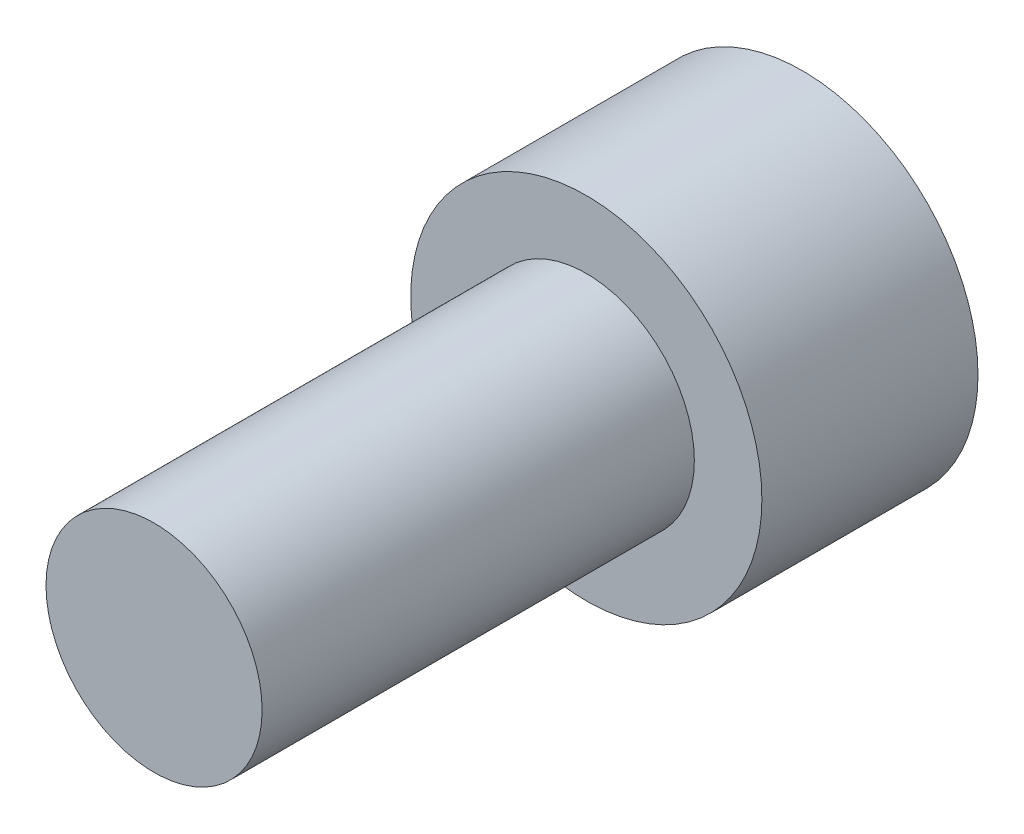
ISO-10303-21;
HEADER;
FILE_DESCRIPTION(('STEP AP214'),'2;1');
FILE_NAME('part.step','',(''),(''),'','','');
FILE_SCHEMA(('AUTOMOTIVE_DESIGN { 1 0 10303 214 1 1 1 1 }'));
ENDSEC;
DATA;
#1=APPLICATION_CONTEXT('core data for automotive mechanical design processes');
#2=APPLICATION_PROTOCOL_DEFINITION('international standard','automotive_design',2000,#1);
#3=PRODUCT_CONTEXT('',#1,'mechanical');
#4=PRODUCT('Part','Part','',(#3));
#5=PRODUCT_RELATED_PRODUCT_CATEGORY('part','',(#4));
#6=PRODUCT_DEFINITION_FORMATION('','',#4);
#7=PRODUCT_DEFINITION_CONTEXT('part definition',#1,'design');
#8=PRODUCT_DEFINITION('design','',#6,#7);
#9=PRODUCT_DEFINITION_SHAPE('','',#8);
#10=(LENGTH_UNIT() NAMED_UNIT(*) SI_UNIT(.MILLI.,.METRE.));
#11=(NAMED_UNIT(*) PLANE_ANGLE_UNIT() SI_UNIT($,.RADIAN.));
#12=(NAMED_UNIT(*) SI_UNIT($,.STERADIAN.) SOLID_ANGLE_UNIT());
#13=UNCERTAINTY_MEASURE_WITH_UNIT(LENGTH_MEASURE(1.E-05),#10,'distance_accuracy_value','');
#14=(GEOMETRIC_REPRESENTATION_CONTEXT(3) GLOBAL_UNCERTAINTY_ASSIGNED_CONTEXT((#13)) GLOBAL_UNIT_ASSIGNED_CONTEXT((#10,
#11,#12)) REPRESENTATION_CONTEXT('',''));
#15=CARTESIAN_POINT('',(0.,0.,0.));
#16=DIRECTION('',(0.,0.,1.));
#17=DIRECTION('',(1.,0.,0.));
#18=AXIS2_PLACEMENT_3D('',#15,#16,#17);
#19=CARTESIAN_POINT('',(0.,0.,8.));
#20=DIRECTION('',(0.,0.,-1.));
#21=DIRECTION('',(-1.,0.,0.));
#22=AXIS2_PLACEMENT_3D('',#19,#20,#21);
#23=CYLINDRICAL_SURFACE('',#22,6.5);
#24=CARTESIAN_POINT('',(0.,0.,8.));
#25=DIRECTION('',(0.,0.,1.));
#26=DIRECTION('',(1.,0.,0.));
#27=AXIS2_PLACEMENT_3D('',#24,#25,#26);
#28=CIRCLE('',#27,6.5);
#29=CARTESIAN_POINT('',(6.5,0.,8.));
#30=VERTEX_POINT('',#29);
#31=EDGE_CURVE('E46',#30,#30,#28,.T.);
#32=ORIENTED_EDGE('',*,*,#31,.F.);
#33=EDGE_LOOP('',(#32));
#34=FACE_BOUND('',#33,.T.);
#35=CARTESIAN_POINT('',(0.,0.,0.));
#36=DIRECTION('',(0.,0.,1.));
#37=DIRECTION('',(1.,0.,0.));
#38=AXIS2_PLACEMENT_3D('',#35,#36,#37);
#39=CIRCLE('',#38,6.5);
#40=CARTESIAN_POINT('',(6.5,0.,0.));
#41=VERTEX_POINT('',#40);
#42=EDGE_CURVE('E45',#41,#41,#39,.T.);
#43=ORIENTED_EDGE('',*,*,#42,.T.);
#44=EDGE_LOOP('',(#43));
#45=FACE_BOUND('',#44,.T.);
#46=ADVANCED_FACE('F39',(#34,#45),#23,.T.);
#47=CARTESIAN_POINT('',(0.,0.,8.));
#48=DIRECTION('',(0.,0.,1.));
#49=DIRECTION('',(1.,0.,0.));
#50=AXIS2_PLACEMENT_3D('',#47,#48,#49);
#51=PLANE('',#50);
#52=CARTESIAN_POINT('',(0.,0.,8.));
#53=DIRECTION('',(0.,0.,1.));
#54=DIRECTION('',(1.,0.,0.));
#55=AXIS2_PLACEMENT_3D('',#52,#53,#54);
#56=CIRCLE('',#55,4.);
#57=CARTESIAN_POINT('',(4.,0.,8.));
#58=VERTEX_POINT('',#57);
#59=EDGE_CURVE('E10',#58,#58,#56,.T.);
#60=ORIENTED_EDGE('',*,*,#59,.F.);
#61=EDGE_LOOP('',(#60));
#62=FACE_BOUND('',#61,.T.);
#63=ORIENTED_EDGE('',*,*,#31,.T.);
#64=EDGE_LOOP('',(#63));
#65=FACE_BOUND('',#64,.T.);
#66=ADVANCED_FACE('F64',(#62,#65),#51,.T.);
#67=CARTESIAN_POINT('',(0.,0.,0.));
#68=DIRECTION('',(0.,0.,1.));
#69=DIRECTION('',(1.,0.,0.));
#70=AXIS2_PLACEMENT_3D('',#67,#68,#69);
#71=PLANE('',#70);
#72=ORIENTED_EDGE('',*,*,#42,.F.);
#73=EDGE_LOOP('',(#72));
#74=FACE_BOUND('',#73,.T.);
#75=ADVANCED_FACE('F58',(#74),#71,.F.);
#76=CARTESIAN_POINT('',(0.,0.,24.));
#77=DIRECTION('',(0.,0.,-1.));
#78=DIRECTION('',(-1.,0.,0.));
#79=AXIS2_PLACEMENT_3D('',#76,#77,#78);
#80=CYLINDRICAL_SURFACE('',#79,4.);
#81=CARTESIAN_POINT('',(0.,0.,24.));
#82=DIRECTION('',(0.,0.,1.));
#83=DIRECTION('',(1.,0.,0.));
#84=AXIS2_PLACEMENT_3D('',#81,#82,#83);
#85=CIRCLE('',#84,4.);
#86=CARTESIAN_POINT('',(4.,0.,24.));
#87=VERTEX_POINT('',#86);
#88=EDGE_CURVE('E55',#87,#87,#85,.T.);
#89=ORIENTED_EDGE('',*,*,#88,.F.);
#90=EDGE_LOOP('',(#89));
#91=FACE_BOUND('',#90,.T.);
#92=ORIENTED_EDGE('',*,*,#59,.T.);
#93=EDGE_LOOP('',(#92));
#94=FACE_BOUND('',#93,.T.);
#95=ADVANCED_FACE('F62',(#91,#94),#80,.T.);
#96=CARTESIAN_POINT('',(0.,0.,24.));
#97=DIRECTION('',(0.,0.,1.));
#98=DIRECTION('',(1.,0.,0.));
#99=AXIS2_PLACEMENT_3D('',#96,#97,#98);
#100=PLANE('',#99);
#101=ORIENTED_EDGE('',*,*,#88,.T.);
#102=EDGE_LOOP('',(#101));
#103=FACE_BOUND('',#102,.T.);
#104=ADVANCED_FACE('F68',(#103),#100,.T.);
#105=CLOSED_SHELL('',(#46,#66,#75,#95,#104));
#106=MANIFOLD_SOLID_BREP('B2',#105);
#107=ADVANCED_BREP_SHAPE_REPRESENTATION('',(#18,#106),#14);
#108=SHAPE_DEFINITION_REPRESENTATION(#9,#107);
ENDSEC;
END-ISO-10303-21;
